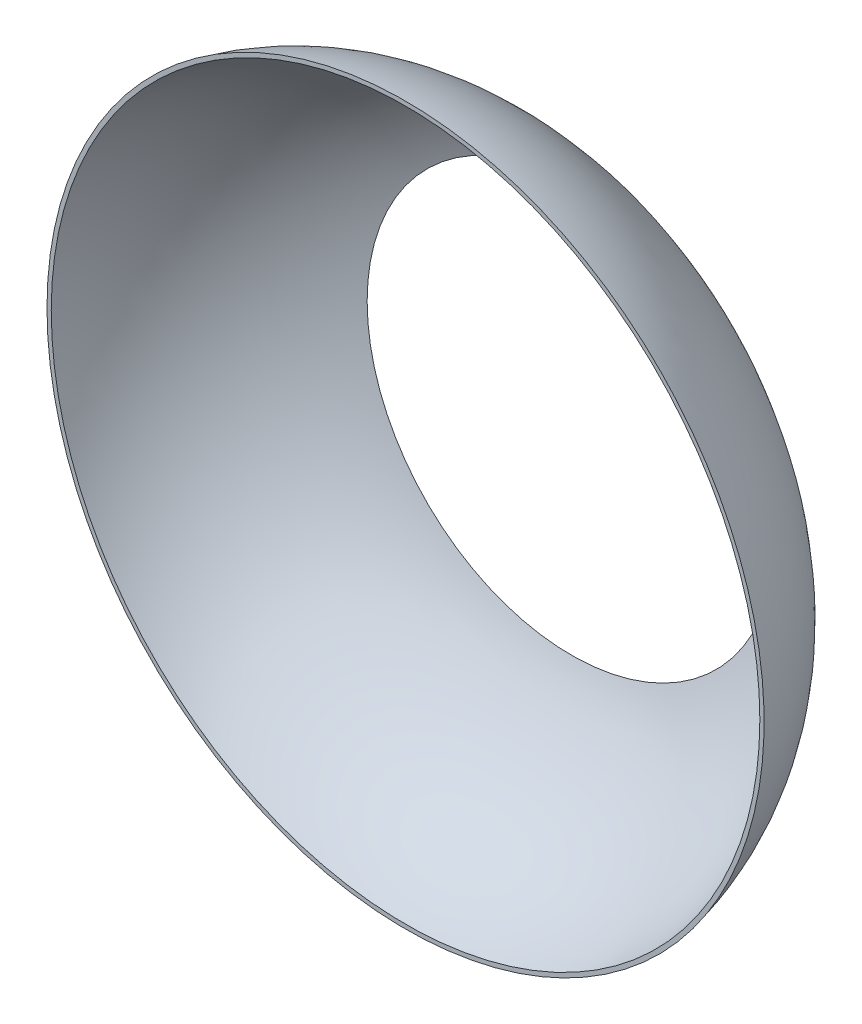
ISO-10303-21;
HEADER;
FILE_DESCRIPTION(('STEP AP214'),'2;1');
FILE_NAME('part.step','',(''),(''),'','','');
FILE_SCHEMA(('AUTOMOTIVE_DESIGN { 1 0 10303 214 1 1 1 1 }'));
ENDSEC;
DATA;
#1=APPLICATION_CONTEXT('core data for automotive mechanical design processes');
#2=APPLICATION_PROTOCOL_DEFINITION('international standard','automotive_design',2000,#1);
#3=PRODUCT_CONTEXT('',#1,'mechanical');
#4=PRODUCT('Part','Part','',(#3));
#5=PRODUCT_RELATED_PRODUCT_CATEGORY('part','',(#4));
#6=PRODUCT_DEFINITION_FORMATION('','',#4);
#7=PRODUCT_DEFINITION_CONTEXT('part definition',#1,'design');
#8=PRODUCT_DEFINITION('design','',#6,#7);
#9=PRODUCT_DEFINITION_SHAPE('','',#8);
#10=(LENGTH_UNIT() NAMED_UNIT(*) SI_UNIT(.MILLI.,.METRE.));
#11=(NAMED_UNIT(*) PLANE_ANGLE_UNIT() SI_UNIT($,.RADIAN.));
#12=(NAMED_UNIT(*) SI_UNIT($,.STERADIAN.) SOLID_ANGLE_UNIT());
#13=UNCERTAINTY_MEASURE_WITH_UNIT(LENGTH_MEASURE(1.E-05),#10,'distance_accuracy_value','');
#14=(GEOMETRIC_REPRESENTATION_CONTEXT(3) GLOBAL_UNCERTAINTY_ASSIGNED_CONTEXT((#13)) GLOBAL_UNIT_ASSIGNED_CONTEXT((#10,
#11,#12)) REPRESENTATION_CONTEXT('',''));
#15=CARTESIAN_POINT('',(0.,0.,0.));
#16=DIRECTION('',(0.,0.,1.));
#17=DIRECTION('',(1.,0.,0.));
#18=AXIS2_PLACEMENT_3D('',#15,#16,#17);
#19=CARTESIAN_POINT('',(0.,0.,26.2692553472909));
#20=DIRECTION('',(0.,0.,-1.));
#21=DIRECTION('',(-1.,0.,0.));
#22=AXIS2_PLACEMENT_3D('',#19,#20,#21);
#23=DEGENERATE_TOROIDAL_SURFACE('',#22,15.6241050813964,28.2687259876234,.T.);
#24=CARTESIAN_POINT('',(0.,0.,20.));
#25=DIRECTION('',(0.,0.,-1.));
#26=DIRECTION('',(-1.,0.,0.));
#27=AXIS2_PLACEMENT_3D('',#24,#25,#26);
#28=CIRCLE('',#27,43.1888888888889);
#29=CARTESIAN_POINT('',(-43.1888888888889,0.,20.));
#30=VERTEX_POINT('',#29);
#31=EDGE_CURVE('E10',#30,#30,#28,.T.);
#32=ORIENTED_EDGE('',*,*,#31,.T.);
#33=EDGE_LOOP('',(#32));
#34=FACE_BOUND('',#33,.T.);
#35=CARTESIAN_POINT('',(0.,0.,0.));
#36=DIRECTION('',(0.,0.,-1.));
#37=DIRECTION('',(-1.,0.,0.));
#38=AXIS2_PLACEMENT_3D('',#35,#36,#37);
#39=CIRCLE('',#38,26.0666666666667);
#40=CARTESIAN_POINT('',(-26.0666666666667,0.,0.));
#41=VERTEX_POINT('',#40);
#42=EDGE_CURVE('E44',#41,#41,#39,.T.);
#43=ORIENTED_EDGE('',*,*,#42,.F.);
#44=EDGE_LOOP('',(#43));
#45=FACE_BOUND('',#44,.T.);
#46=ADVANCED_FACE('F37',(#34,#45),#23,.T.);
#47=CARTESIAN_POINT('',(0.,0.,20.));
#48=DIRECTION('',(0.,0.,1.));
#49=DIRECTION('',(1.,0.,0.));
#50=AXIS2_PLACEMENT_3D('',#47,#48,#49);
#51=PLANE('',#50);
#52=CARTESIAN_POINT('',(0.,0.,20.));
#53=DIRECTION('',(0.,0.,1.));
#54=DIRECTION('',(1.,0.,0.));
#55=AXIS2_PLACEMENT_3D('',#52,#53,#54);
#56=CIRCLE('',#55,42.6758810002927);
#57=CARTESIAN_POINT('',(42.6758810002927,0.,20.));
#58=VERTEX_POINT('',#57);
#59=EDGE_CURVE('E49',#58,#58,#56,.F.);
#60=ORIENTED_EDGE('',*,*,#59,.T.);
#61=EDGE_LOOP('',(#60));
#62=FACE_BOUND('',#61,.T.);
#63=ORIENTED_EDGE('',*,*,#31,.F.);
#64=EDGE_LOOP('',(#63));
#65=FACE_BOUND('',#64,.T.);
#66=ADVANCED_FACE('F65',(#62,#65),#51,.T.);
#67=CARTESIAN_POINT('',(-26.0666666666667,0.,0.));
#68=DIRECTION('',(0.,0.,-1.));
#69=DIRECTION('',(-1.,0.,0.));
#70=AXIS2_PLACEMENT_3D('',#67,#68,#69);
#71=PLANE('',#70);
#72=CARTESIAN_POINT('',(0.,0.,0.));
#73=DIRECTION('',(0.,0.,-1.));
#74=DIRECTION('',(-1.,0.,0.));
#75=AXIS2_PLACEMENT_3D('',#72,#73,#74);
#76=CIRCLE('',#75,24.6256808587);
#77=CARTESIAN_POINT('',(-24.6256808587,0.,0.));
#78=VERTEX_POINT('',#77);
#79=EDGE_CURVE('E54',#78,#78,#76,.T.);
#80=ORIENTED_EDGE('',*,*,#79,.F.);
#81=EDGE_LOOP('',(#80));
#82=FACE_BOUND('',#81,.T.);
#83=ORIENTED_EDGE('',*,*,#42,.T.);
#84=EDGE_LOOP('',(#83));
#85=FACE_BOUND('',#84,.T.);
#86=ADVANCED_FACE('F63',(#82,#85),#71,.T.);
#87=CARTESIAN_POINT('',(0.,0.,26.2692553472909));
#88=DIRECTION('',(0.,0.,-1.));
#89=DIRECTION('',(-1.,0.,0.));
#90=AXIS2_PLACEMENT_3D('',#87,#88,#89);
#91=DEGENERATE_TOROIDAL_SURFACE('',#90,15.6241050813964,27.7687259876234,.T.);
#92=ORIENTED_EDGE('',*,*,#59,.F.);
#93=EDGE_LOOP('',(#92));
#94=FACE_BOUND('',#93,.T.);
#95=ORIENTED_EDGE('',*,*,#79,.T.);
#96=EDGE_LOOP('',(#95));
#97=FACE_BOUND('',#96,.T.);
#98=ADVANCED_FACE('F61',(#94,#97),#91,.F.);
#99=CLOSED_SHELL('',(#46,#66,#86,#98));
#100=MANIFOLD_SOLID_BREP('B2',#99);
#101=ADVANCED_BREP_SHAPE_REPRESENTATION('',(#18,#100),#14);
#102=SHAPE_DEFINITION_REPRESENTATION(#9,#101);
ENDSEC;
END-ISO-10303-21;
